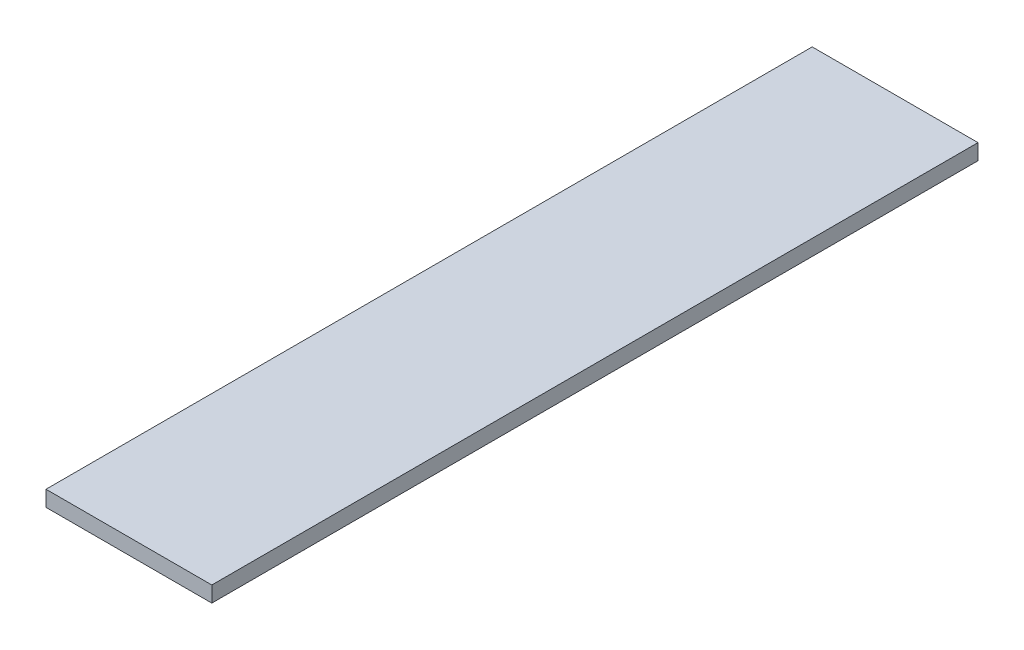
ISO-10303-21;
HEADER;
FILE_DESCRIPTION(('STEP AP214'),'2;1');
FILE_NAME('part.step','',(''),(''),'','','');
FILE_SCHEMA(('AUTOMOTIVE_DESIGN { 1 0 10303 214 1 1 1 1 }'));
ENDSEC;
DATA;
#1=APPLICATION_CONTEXT('core data for automotive mechanical design processes');
#2=APPLICATION_PROTOCOL_DEFINITION('international standard','automotive_design',2000,#1);
#3=PRODUCT_CONTEXT('',#1,'mechanical');
#4=PRODUCT('Part','Part','',(#3));
#5=PRODUCT_RELATED_PRODUCT_CATEGORY('part','',(#4));
#6=PRODUCT_DEFINITION_FORMATION('','',#4);
#7=PRODUCT_DEFINITION_CONTEXT('part definition',#1,'design');
#8=PRODUCT_DEFINITION('design','',#6,#7);
#9=PRODUCT_DEFINITION_SHAPE('','',#8);
#10=(LENGTH_UNIT() NAMED_UNIT(*) SI_UNIT(.MILLI.,.METRE.));
#11=(NAMED_UNIT(*) PLANE_ANGLE_UNIT() SI_UNIT($,.RADIAN.));
#12=(NAMED_UNIT(*) SI_UNIT($,.STERADIAN.) SOLID_ANGLE_UNIT());
#13=UNCERTAINTY_MEASURE_WITH_UNIT(LENGTH_MEASURE(1.E-05),#10,'distance_accuracy_value','');
#14=(GEOMETRIC_REPRESENTATION_CONTEXT(3) GLOBAL_UNCERTAINTY_ASSIGNED_CONTEXT((#13)) GLOBAL_UNIT_ASSIGNED_CONTEXT((#10,
#11,#12)) REPRESENTATION_CONTEXT('',''));
#15=CARTESIAN_POINT('',(0.,0.,0.));
#16=DIRECTION('',(0.,0.,1.));
#17=DIRECTION('',(1.,0.,0.));
#18=AXIS2_PLACEMENT_3D('',#15,#16,#17);
#19=CARTESIAN_POINT('',(0.,0.,850.9));
#20=DIRECTION('',(1.,0.,0.));
#21=DIRECTION('',(0.,0.,-1.));
#22=AXIS2_PLACEMENT_3D('',#19,#20,#21);
#23=PLANE('',#22);
#24=DIRECTION('',(0.,-1.,0.));
#25=VECTOR('',#24,1.);
#26=CARTESIAN_POINT('',(0.,0.,0.));
#27=LINE('',#26,#25);
#28=CARTESIAN_POINT('',(0.,17.4498,0.));
#29=VERTEX_POINT('',#28);
#30=CARTESIAN_POINT('',(0.,0.,0.));
#31=VERTEX_POINT('',#30);
#32=EDGE_CURVE('E98',#29,#31,#27,.T.);
#33=ORIENTED_EDGE('',*,*,#32,.T.);
#34=DIRECTION('',(0.,0.,-1.));
#35=VECTOR('',#34,1.);
#36=CARTESIAN_POINT('',(0.,0.,850.9));
#37=LINE('',#36,#35);
#38=CARTESIAN_POINT('',(0.,0.,850.9));
#39=VERTEX_POINT('',#38);
#40=EDGE_CURVE('E11',#39,#31,#37,.T.);
#41=ORIENTED_EDGE('',*,*,#40,.F.);
#42=DIRECTION('',(0.,-1.,0.));
#43=VECTOR('',#42,1.);
#44=CARTESIAN_POINT('',(0.,0.,850.9));
#45=LINE('',#44,#43);
#46=CARTESIAN_POINT('',(0.,17.4498,850.9));
#47=VERTEX_POINT('',#46);
#48=EDGE_CURVE('E86',#47,#39,#45,.T.);
#49=ORIENTED_EDGE('',*,*,#48,.F.);
#50=DIRECTION('',(0.,0.,-1.));
#51=VECTOR('',#50,1.);
#52=CARTESIAN_POINT('',(0.,17.4498,850.9));
#53=LINE('',#52,#51);
#54=EDGE_CURVE('E94',#47,#29,#53,.T.);
#55=ORIENTED_EDGE('',*,*,#54,.T.);
#56=EDGE_LOOP('',(#33,#41,#49,#55));
#57=FACE_BOUND('',#56,.T.);
#58=ADVANCED_FACE('F35',(#57),#23,.F.);
#59=CARTESIAN_POINT('',(0.,0.,850.9));
#60=DIRECTION('',(0.,1.,0.));
#61=DIRECTION('',(0.,0.,1.));
#62=AXIS2_PLACEMENT_3D('',#59,#60,#61);
#63=PLANE('',#62);
#64=DIRECTION('',(1.,0.,0.));
#65=VECTOR('',#64,1.);
#66=CARTESIAN_POINT('',(0.,0.,0.));
#67=LINE('',#66,#65);
#68=CARTESIAN_POINT('',(184.15,0.,0.));
#69=VERTEX_POINT('',#68);
#70=EDGE_CURVE('E90',#31,#69,#67,.T.);
#71=ORIENTED_EDGE('',*,*,#70,.T.);
#72=DIRECTION('',(0.,0.,-1.));
#73=VECTOR('',#72,1.);
#74=CARTESIAN_POINT('',(184.15,0.,850.9));
#75=LINE('',#74,#73);
#76=CARTESIAN_POINT('',(184.15,0.,850.9));
#77=VERTEX_POINT('',#76);
#78=EDGE_CURVE('E43',#77,#69,#75,.T.);
#79=ORIENTED_EDGE('',*,*,#78,.F.);
#80=DIRECTION('',(1.,0.,0.));
#81=VECTOR('',#80,1.);
#82=CARTESIAN_POINT('',(0.,0.,850.9));
#83=LINE('',#82,#81);
#84=EDGE_CURVE('E81',#39,#77,#83,.T.);
#85=ORIENTED_EDGE('',*,*,#84,.F.);
#86=ORIENTED_EDGE('',*,*,#40,.T.);
#87=EDGE_LOOP('',(#71,#79,#85,#86));
#88=FACE_BOUND('',#87,.T.);
#89=ADVANCED_FACE('F89',(#88),#63,.F.);
#90=CARTESIAN_POINT('',(184.15,0.,850.9));
#91=DIRECTION('',(-1.,0.,0.));
#92=DIRECTION('',(0.,0.,1.));
#93=AXIS2_PLACEMENT_3D('',#90,#91,#92);
#94=PLANE('',#93);
#95=DIRECTION('',(0.,1.,0.));
#96=VECTOR('',#95,1.);
#97=CARTESIAN_POINT('',(184.15,0.,0.));
#98=LINE('',#97,#96);
#99=CARTESIAN_POINT('',(184.15,17.4498,0.));
#100=VERTEX_POINT('',#99);
#101=EDGE_CURVE('E68',#69,#100,#98,.T.);
#102=ORIENTED_EDGE('',*,*,#101,.T.);
#103=DIRECTION('',(0.,0.,-1.));
#104=VECTOR('',#103,1.);
#105=CARTESIAN_POINT('',(184.15,17.4498,850.9));
#106=LINE('',#105,#104);
#107=CARTESIAN_POINT('',(184.15,17.4498,850.9));
#108=VERTEX_POINT('',#107);
#109=EDGE_CURVE('E91',#108,#100,#106,.T.);
#110=ORIENTED_EDGE('',*,*,#109,.F.);
#111=DIRECTION('',(0.,1.,0.));
#112=VECTOR('',#111,1.);
#113=CARTESIAN_POINT('',(184.15,0.,850.9));
#114=LINE('',#113,#112);
#115=EDGE_CURVE('E84',#77,#108,#114,.T.);
#116=ORIENTED_EDGE('',*,*,#115,.F.);
#117=ORIENTED_EDGE('',*,*,#78,.T.);
#118=EDGE_LOOP('',(#102,#110,#116,#117));
#119=FACE_BOUND('',#118,.T.);
#120=ADVANCED_FACE('F92',(#119),#94,.F.);
#121=CARTESIAN_POINT('',(0.,17.4498,850.9));
#122=DIRECTION('',(0.,-1.,0.));
#123=DIRECTION('',(0.,0.,-1.));
#124=AXIS2_PLACEMENT_3D('',#121,#122,#123);
#125=PLANE('',#124);
#126=DIRECTION('',(-1.,0.,0.));
#127=VECTOR('',#126,1.);
#128=CARTESIAN_POINT('',(0.,17.4498,0.));
#129=LINE('',#128,#127);
#130=EDGE_CURVE('E74',#100,#29,#129,.T.);
#131=ORIENTED_EDGE('',*,*,#130,.T.);
#132=ORIENTED_EDGE('',*,*,#54,.F.);
#133=DIRECTION('',(-1.,0.,0.));
#134=VECTOR('',#133,1.);
#135=CARTESIAN_POINT('',(0.,17.4498,850.9));
#136=LINE('',#135,#134);
#137=EDGE_CURVE('E51',#108,#47,#136,.T.);
#138=ORIENTED_EDGE('',*,*,#137,.F.);
#139=ORIENTED_EDGE('',*,*,#109,.T.);
#140=EDGE_LOOP('',(#131,#132,#138,#139));
#141=FACE_BOUND('',#140,.T.);
#142=ADVANCED_FACE('F105',(#141),#125,.F.);
#143=CARTESIAN_POINT('',(0.,0.,850.9));
#144=DIRECTION('',(0.,0.,-1.));
#145=DIRECTION('',(-1.,0.,0.));
#146=AXIS2_PLACEMENT_3D('',#143,#144,#145);
#147=PLANE('',#146);
#148=ORIENTED_EDGE('',*,*,#48,.T.);
#149=ORIENTED_EDGE('',*,*,#84,.T.);
#150=ORIENTED_EDGE('',*,*,#115,.T.);
#151=ORIENTED_EDGE('',*,*,#137,.T.);
#152=EDGE_LOOP('',(#148,#149,#150,#151));
#153=FACE_BOUND('',#152,.T.);
#154=ADVANCED_FACE('F82',(#153),#147,.F.);
#155=CARTESIAN_POINT('',(0.,0.,0.));
#156=DIRECTION('',(0.,0.,-1.));
#157=DIRECTION('',(-1.,0.,0.));
#158=AXIS2_PLACEMENT_3D('',#155,#156,#157);
#159=PLANE('',#158);
#160=ORIENTED_EDGE('',*,*,#32,.F.);
#161=ORIENTED_EDGE('',*,*,#130,.F.);
#162=ORIENTED_EDGE('',*,*,#101,.F.);
#163=ORIENTED_EDGE('',*,*,#70,.F.);
#164=EDGE_LOOP('',(#160,#161,#162,#163));
#165=FACE_BOUND('',#164,.T.);
#166=ADVANCED_FACE('F108',(#165),#159,.T.);
#167=CLOSED_SHELL('',(#58,#89,#120,#142,#154,#166));
#168=MANIFOLD_SOLID_BREP('B2',#167);
#169=ADVANCED_BREP_SHAPE_REPRESENTATION('',(#18,#168),#14);
#170=SHAPE_DEFINITION_REPRESENTATION(#9,#169);
ENDSEC;
END-ISO-10303-21;
